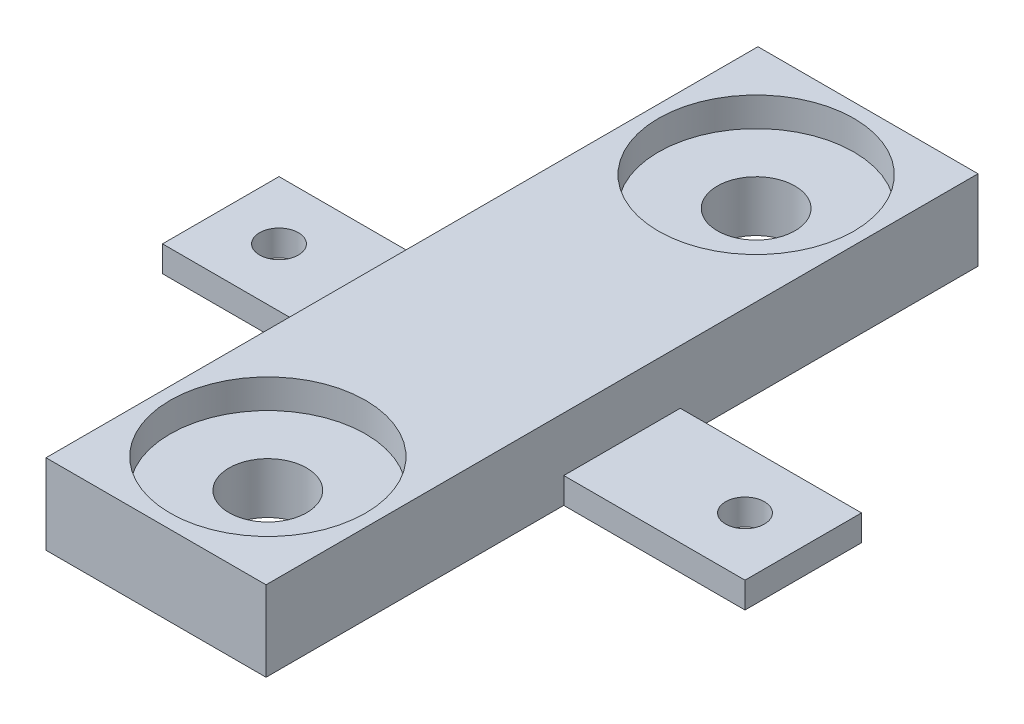
ISO-10303-21;
HEADER;
FILE_DESCRIPTION(('STEP AP214'),'2;1');
FILE_NAME('part.step','',(''),(''),'','','');
FILE_SCHEMA(('AUTOMOTIVE_DESIGN { 1 0 10303 214 1 1 1 1 }'));
ENDSEC;
DATA;
#1=APPLICATION_CONTEXT('core data for automotive mechanical design processes');
#2=APPLICATION_PROTOCOL_DEFINITION('international standard','automotive_design',2000,#1);
#3=PRODUCT_CONTEXT('',#1,'mechanical');
#4=PRODUCT('Part','Part','',(#3));
#5=PRODUCT_RELATED_PRODUCT_CATEGORY('part','',(#4));
#6=PRODUCT_DEFINITION_FORMATION('','',#4);
#7=PRODUCT_DEFINITION_CONTEXT('part definition',#1,'design');
#8=PRODUCT_DEFINITION('design','',#6,#7);
#9=PRODUCT_DEFINITION_SHAPE('','',#8);
#10=(LENGTH_UNIT() NAMED_UNIT(*) SI_UNIT(.MILLI.,.METRE.));
#11=(NAMED_UNIT(*) PLANE_ANGLE_UNIT() SI_UNIT($,.RADIAN.));
#12=(NAMED_UNIT(*) SI_UNIT($,.STERADIAN.) SOLID_ANGLE_UNIT());
#13=UNCERTAINTY_MEASURE_WITH_UNIT(LENGTH_MEASURE(1.E-05),#10,'distance_accuracy_value','');
#14=(GEOMETRIC_REPRESENTATION_CONTEXT(3) GLOBAL_UNCERTAINTY_ASSIGNED_CONTEXT((#13)) GLOBAL_UNIT_ASSIGNED_CONTEXT((#10,
#11,#12)) REPRESENTATION_CONTEXT('',''));
#15=CARTESIAN_POINT('',(0.,0.,0.));
#16=DIRECTION('',(0.,0.,1.));
#17=DIRECTION('',(1.,0.,0.));
#18=AXIS2_PLACEMENT_3D('',#15,#16,#17);
#19=CARTESIAN_POINT('',(0.,2.,0.));
#20=DIRECTION('',(0.,1.,0.));
#21=DIRECTION('',(0.,0.,1.));
#22=AXIS2_PLACEMENT_3D('',#19,#20,#21);
#23=PLANE('',#22);
#24=CARTESIAN_POINT('',(-18.,2.,0.));
#25=DIRECTION('',(0.,1.,0.));
#26=DIRECTION('',(0.,0.,1.));
#27=AXIS2_PLACEMENT_3D('',#24,#25,#26);
#28=CIRCLE('',#27,1.5);
#29=CARTESIAN_POINT('',(-18.,2.,1.5));
#30=VERTEX_POINT('',#29);
#31=EDGE_CURVE('E169',#30,#30,#28,.T.);
#32=ORIENTED_EDGE('',*,*,#31,.F.);
#33=EDGE_LOOP('',(#32));
#34=FACE_BOUND('',#33,.T.);
#35=DIRECTION('',(-1.,0.,0.));
#36=VECTOR('',#35,1.);
#37=CARTESIAN_POINT('',(0.,2.,4.49999999999999));
#38=LINE('',#37,#36);
#39=CARTESIAN_POINT('',(-8.5,2.,4.5));
#40=VERTEX_POINT('',#39);
#41=CARTESIAN_POINT('',(-22.5,2.,4.5));
#42=VERTEX_POINT('',#41);
#43=EDGE_CURVE('E155',#40,#42,#38,.T.);
#44=ORIENTED_EDGE('',*,*,#43,.F.);
#45=DIRECTION('',(0.,0.,-1.));
#46=VECTOR('',#45,1.);
#47=CARTESIAN_POINT('',(-8.5,2.,0.));
#48=LINE('',#47,#46);
#49=CARTESIAN_POINT('',(-8.5,2.,-4.5));
#50=VERTEX_POINT('',#49);
#51=EDGE_CURVE('E255',#40,#50,#48,.T.);
#52=ORIENTED_EDGE('',*,*,#51,.T.);
#53=DIRECTION('',(-1.,0.,0.));
#54=VECTOR('',#53,1.);
#55=CARTESIAN_POINT('',(0.,2.,-4.49999999999999));
#56=LINE('',#55,#54);
#57=CARTESIAN_POINT('',(-22.5,2.,-4.5));
#58=VERTEX_POINT('',#57);
#59=EDGE_CURVE('E138',#50,#58,#56,.T.);
#60=ORIENTED_EDGE('',*,*,#59,.T.);
#61=DIRECTION('',(0.,0.,1.));
#62=VECTOR('',#61,1.);
#63=CARTESIAN_POINT('',(-22.5,2.,0.));
#64=LINE('',#63,#62);
#65=EDGE_CURVE('E269',#58,#42,#64,.T.);
#66=ORIENTED_EDGE('',*,*,#65,.T.);
#67=EDGE_LOOP('',(#44,#52,#60,#66));
#68=FACE_BOUND('',#67,.T.);
#69=ADVANCED_FACE('F64',(#34,#68),#23,.T.);
#70=CARTESIAN_POINT('',(0.,2.,-27.5));
#71=DIRECTION('',(0.,0.,-1.));
#72=DIRECTION('',(-1.,0.,0.));
#73=AXIS2_PLACEMENT_3D('',#70,#71,#72);
#74=PLANE('',#73);
#75=DIRECTION('',(1.,0.,0.));
#76=VECTOR('',#75,1.);
#77=CARTESIAN_POINT('',(0.,0.,-27.5));
#78=LINE('',#77,#76);
#79=CARTESIAN_POINT('',(-8.5,0.,-27.5));
#80=VERTEX_POINT('',#79);
#81=CARTESIAN_POINT('',(8.5,0.,-27.5));
#82=VERTEX_POINT('',#81);
#83=EDGE_CURVE('E180',#80,#82,#78,.T.);
#84=ORIENTED_EDGE('',*,*,#83,.F.);
#85=DIRECTION('',(0.,-1.,0.));
#86=VECTOR('',#85,1.);
#87=CARTESIAN_POINT('',(-8.5,2.,-27.5));
#88=LINE('',#87,#86);
#89=CARTESIAN_POINT('',(-8.5,6.19,-27.5));
#90=VERTEX_POINT('',#89);
#91=EDGE_CURVE('E229',#90,#80,#88,.T.);
#92=ORIENTED_EDGE('',*,*,#91,.F.);
#93=DIRECTION('',(1.,0.,0.));
#94=VECTOR('',#93,1.);
#95=CARTESIAN_POINT('',(0.,6.19,-27.5));
#96=LINE('',#95,#94);
#97=CARTESIAN_POINT('',(8.5,6.19,-27.5));
#98=VERTEX_POINT('',#97);
#99=EDGE_CURVE('E261',#90,#98,#96,.T.);
#100=ORIENTED_EDGE('',*,*,#99,.T.);
#101=DIRECTION('',(0.,-1.,0.));
#102=VECTOR('',#101,1.);
#103=CARTESIAN_POINT('',(8.5,2.,-27.5));
#104=LINE('',#103,#102);
#105=EDGE_CURVE('E231',#98,#82,#104,.T.);
#106=ORIENTED_EDGE('',*,*,#105,.T.);
#107=EDGE_LOOP('',(#84,#92,#100,#106));
#108=FACE_BOUND('',#107,.T.);
#109=ADVANCED_FACE('F66',(#108),#74,.T.);
#110=CARTESIAN_POINT('',(0.,2.,-4.49999999999999));
#111=DIRECTION('',(0.,0.,1.));
#112=DIRECTION('',(1.,0.,0.));
#113=AXIS2_PLACEMENT_3D('',#110,#111,#112);
#114=PLANE('',#113);
#115=DIRECTION('',(-1.,0.,0.));
#116=VECTOR('',#115,1.);
#117=CARTESIAN_POINT('',(0.,0.,-4.49999999999999));
#118=LINE('',#117,#116);
#119=CARTESIAN_POINT('',(-8.5,0.,-4.5));
#120=VERTEX_POINT('',#119);
#121=CARTESIAN_POINT('',(-22.5,0.,-4.5));
#122=VERTEX_POINT('',#121);
#123=EDGE_CURVE('E187',#120,#122,#118,.T.);
#124=ORIENTED_EDGE('',*,*,#123,.T.);
#125=DIRECTION('',(0.,-1.,0.));
#126=VECTOR('',#125,1.);
#127=CARTESIAN_POINT('',(-22.5,2.,-4.5));
#128=LINE('',#127,#126);
#129=EDGE_CURVE('E223',#58,#122,#128,.T.);
#130=ORIENTED_EDGE('',*,*,#129,.F.);
#131=ORIENTED_EDGE('',*,*,#59,.F.);
#132=DIRECTION('',(0.,-1.,0.));
#133=VECTOR('',#132,1.);
#134=CARTESIAN_POINT('',(-8.5,2.,-4.5));
#135=LINE('',#134,#133);
#136=EDGE_CURVE('E226',#50,#120,#135,.T.);
#137=ORIENTED_EDGE('',*,*,#136,.T.);
#138=EDGE_LOOP('',(#124,#130,#131,#137));
#139=FACE_BOUND('',#138,.T.);
#140=ADVANCED_FACE('F336',(#139),#114,.F.);
#141=CARTESIAN_POINT('',(-22.5,2.,0.));
#142=DIRECTION('',(1.,0.,0.));
#143=DIRECTION('',(0.,0.,-1.));
#144=AXIS2_PLACEMENT_3D('',#141,#142,#143);
#145=PLANE('',#144);
#146=DIRECTION('',(0.,0.,1.));
#147=VECTOR('',#146,1.);
#148=CARTESIAN_POINT('',(-22.5,0.,0.));
#149=LINE('',#148,#147);
#150=CARTESIAN_POINT('',(-22.5,0.,4.5));
#151=VERTEX_POINT('',#150);
#152=EDGE_CURVE('E190',#122,#151,#149,.T.);
#153=ORIENTED_EDGE('',*,*,#152,.T.);
#154=DIRECTION('',(0.,-1.,0.));
#155=VECTOR('',#154,1.);
#156=CARTESIAN_POINT('',(-22.5,2.,4.5));
#157=LINE('',#156,#155);
#158=EDGE_CURVE('E221',#42,#151,#157,.T.);
#159=ORIENTED_EDGE('',*,*,#158,.F.);
#160=ORIENTED_EDGE('',*,*,#65,.F.);
#161=ORIENTED_EDGE('',*,*,#129,.T.);
#162=EDGE_LOOP('',(#153,#159,#160,#161));
#163=FACE_BOUND('',#162,.T.);
#164=ADVANCED_FACE('F490',(#163),#145,.F.);
#165=CARTESIAN_POINT('',(0.,2.,4.49999999999999));
#166=DIRECTION('',(0.,0.,1.));
#167=DIRECTION('',(1.,0.,0.));
#168=AXIS2_PLACEMENT_3D('',#165,#166,#167);
#169=PLANE('',#168);
#170=DIRECTION('',(-1.,0.,0.));
#171=VECTOR('',#170,1.);
#172=CARTESIAN_POINT('',(0.,0.,4.49999999999999));
#173=LINE('',#172,#171);
#174=CARTESIAN_POINT('',(-8.5,0.,4.49999999999999));
#175=VERTEX_POINT('',#174);
#176=EDGE_CURVE('E193',#175,#151,#173,.T.);
#177=ORIENTED_EDGE('',*,*,#176,.F.);
#178=DIRECTION('',(0.,-1.,0.));
#179=VECTOR('',#178,1.);
#180=CARTESIAN_POINT('',(-8.5,2.,4.49999999999999));
#181=LINE('',#180,#179);
#182=EDGE_CURVE('E219',#40,#175,#181,.T.);
#183=ORIENTED_EDGE('',*,*,#182,.F.);
#184=ORIENTED_EDGE('',*,*,#43,.T.);
#185=ORIENTED_EDGE('',*,*,#158,.T.);
#186=EDGE_LOOP('',(#177,#183,#184,#185));
#187=FACE_BOUND('',#186,.T.);
#188=ADVANCED_FACE('F275',(#187),#169,.T.);
#189=CARTESIAN_POINT('',(-8.5,2.,0.));
#190=DIRECTION('',(1.,0.,0.));
#191=DIRECTION('',(0.,0.,-1.));
#192=AXIS2_PLACEMENT_3D('',#189,#190,#191);
#193=PLANE('',#192);
#194=DIRECTION('',(0.,0.,1.));
#195=VECTOR('',#194,1.);
#196=CARTESIAN_POINT('',(-8.5,0.,0.));
#197=LINE('',#196,#195);
#198=CARTESIAN_POINT('',(-8.49999999999999,0.,27.5));
#199=VERTEX_POINT('',#198);
#200=EDGE_CURVE('E188',#175,#199,#197,.T.);
#201=ORIENTED_EDGE('',*,*,#200,.T.);
#202=DIRECTION('',(0.,-1.,0.));
#203=VECTOR('',#202,1.);
#204=CARTESIAN_POINT('',(-8.49999999999999,2.,27.5));
#205=LINE('',#204,#203);
#206=CARTESIAN_POINT('',(-8.49999999999999,6.19,27.5));
#207=VERTEX_POINT('',#206);
#208=EDGE_CURVE('E216',#207,#199,#205,.T.);
#209=ORIENTED_EDGE('',*,*,#208,.F.);
#210=DIRECTION('',(0.,0.,1.));
#211=VECTOR('',#210,1.);
#212=CARTESIAN_POINT('',(-8.5,6.19,0.));
#213=LINE('',#212,#211);
#214=EDGE_CURVE('E181',#90,#207,#213,.T.);
#215=ORIENTED_EDGE('',*,*,#214,.F.);
#216=ORIENTED_EDGE('',*,*,#91,.T.);
#217=EDGE_CURVE('E185',#80,#120,#197,.T.);
#218=ORIENTED_EDGE('',*,*,#217,.T.);
#219=ORIENTED_EDGE('',*,*,#136,.F.);
#220=ORIENTED_EDGE('',*,*,#51,.F.);
#221=ORIENTED_EDGE('',*,*,#182,.T.);
#222=EDGE_LOOP('',(#201,#209,#215,#216,#218,#219,#220,#221));
#223=FACE_BOUND('',#222,.T.);
#224=ADVANCED_FACE('F311',(#223),#193,.F.);
#225=CARTESIAN_POINT('',(0.,2.,27.5));
#226=DIRECTION('',(0.,0.,-1.));
#227=DIRECTION('',(-1.,0.,0.));
#228=AXIS2_PLACEMENT_3D('',#225,#226,#227);
#229=PLANE('',#228);
#230=DIRECTION('',(1.,0.,0.));
#231=VECTOR('',#230,1.);
#232=CARTESIAN_POINT('',(0.,0.,27.5));
#233=LINE('',#232,#231);
#234=CARTESIAN_POINT('',(8.5,0.,27.5));
#235=VERTEX_POINT('',#234);
#236=EDGE_CURVE('E196',#199,#235,#233,.T.);
#237=ORIENTED_EDGE('',*,*,#236,.T.);
#238=DIRECTION('',(0.,-1.,0.));
#239=VECTOR('',#238,1.);
#240=CARTESIAN_POINT('',(8.5,2.,27.5));
#241=LINE('',#240,#239);
#242=CARTESIAN_POINT('',(8.5,6.19,27.5));
#243=VERTEX_POINT('',#242);
#244=EDGE_CURVE('E214',#243,#235,#241,.T.);
#245=ORIENTED_EDGE('',*,*,#244,.F.);
#246=DIRECTION('',(1.,0.,0.));
#247=VECTOR('',#246,1.);
#248=CARTESIAN_POINT('',(0.,6.19,27.5));
#249=LINE('',#248,#247);
#250=EDGE_CURVE('E252',#207,#243,#249,.T.);
#251=ORIENTED_EDGE('',*,*,#250,.F.);
#252=ORIENTED_EDGE('',*,*,#208,.T.);
#253=EDGE_LOOP('',(#237,#245,#251,#252));
#254=FACE_BOUND('',#253,.T.);
#255=ADVANCED_FACE('F298',(#254),#229,.F.);
#256=CARTESIAN_POINT('',(8.5,2.,0.));
#257=DIRECTION('',(1.,0.,0.));
#258=DIRECTION('',(0.,0.,-1.));
#259=AXIS2_PLACEMENT_3D('',#256,#257,#258);
#260=PLANE('',#259);
#261=DIRECTION('',(0.,0.,1.));
#262=VECTOR('',#261,1.);
#263=CARTESIAN_POINT('',(8.5,0.,0.));
#264=LINE('',#263,#262);
#265=CARTESIAN_POINT('',(8.5,0.,4.5));
#266=VERTEX_POINT('',#265);
#267=EDGE_CURVE('E182',#266,#235,#264,.T.);
#268=ORIENTED_EDGE('',*,*,#267,.F.);
#269=DIRECTION('',(0.,-1.,0.));
#270=VECTOR('',#269,1.);
#271=CARTESIAN_POINT('',(8.5,2.,4.5));
#272=LINE('',#271,#270);
#273=CARTESIAN_POINT('',(8.5,2.,4.49999999999999));
#274=VERTEX_POINT('',#273);
#275=EDGE_CURVE('E164',#274,#266,#272,.T.);
#276=ORIENTED_EDGE('',*,*,#275,.F.);
#277=DIRECTION('',(0.,0.,-1.));
#278=VECTOR('',#277,1.);
#279=CARTESIAN_POINT('',(8.5,2.,0.));
#280=LINE('',#279,#278);
#281=CARTESIAN_POINT('',(8.5,2.,-4.5));
#282=VERTEX_POINT('',#281);
#283=EDGE_CURVE('E83',#274,#282,#280,.T.);
#284=ORIENTED_EDGE('',*,*,#283,.T.);
#285=DIRECTION('',(0.,-1.,0.));
#286=VECTOR('',#285,1.);
#287=CARTESIAN_POINT('',(8.5,2.,-4.5));
#288=LINE('',#287,#286);
#289=CARTESIAN_POINT('',(8.5,0.,-4.5));
#290=VERTEX_POINT('',#289);
#291=EDGE_CURVE('E129',#282,#290,#288,.T.);
#292=ORIENTED_EDGE('',*,*,#291,.T.);
#293=EDGE_CURVE('E178',#82,#290,#264,.T.);
#294=ORIENTED_EDGE('',*,*,#293,.F.);
#295=ORIENTED_EDGE('',*,*,#105,.F.);
#296=DIRECTION('',(0.,0.,1.));
#297=VECTOR('',#296,1.);
#298=CARTESIAN_POINT('',(8.5,6.19,0.));
#299=LINE('',#298,#297);
#300=EDGE_CURVE('E258',#98,#243,#299,.T.);
#301=ORIENTED_EDGE('',*,*,#300,.T.);
#302=ORIENTED_EDGE('',*,*,#244,.T.);
#303=EDGE_LOOP('',(#268,#276,#284,#292,#294,#295,#301,#302));
#304=FACE_BOUND('',#303,.T.);
#305=ADVANCED_FACE('F307',(#304),#260,.T.);
#306=CARTESIAN_POINT('',(0.,2.,4.5));
#307=DIRECTION('',(0.,0.,-1.));
#308=DIRECTION('',(-1.,0.,0.));
#309=AXIS2_PLACEMENT_3D('',#306,#307,#308);
#310=PLANE('',#309);
#311=DIRECTION('',(1.,0.,0.));
#312=VECTOR('',#311,1.);
#313=CARTESIAN_POINT('',(0.,0.,4.5));
#314=LINE('',#313,#312);
#315=CARTESIAN_POINT('',(22.5,0.,4.49999999999999));
#316=VERTEX_POINT('',#315);
#317=EDGE_CURVE('E161',#266,#316,#314,.T.);
#318=ORIENTED_EDGE('',*,*,#317,.T.);
#319=DIRECTION('',(0.,-1.,0.));
#320=VECTOR('',#319,1.);
#321=CARTESIAN_POINT('',(22.5,2.,4.49999999999999));
#322=LINE('',#321,#320);
#323=CARTESIAN_POINT('',(22.5,2.,4.49999999999999));
#324=VERTEX_POINT('',#323);
#325=EDGE_CURVE('E158',#324,#316,#322,.T.);
#326=ORIENTED_EDGE('',*,*,#325,.F.);
#327=DIRECTION('',(1.,0.,0.));
#328=VECTOR('',#327,1.);
#329=CARTESIAN_POINT('',(0.,2.,4.5));
#330=LINE('',#329,#328);
#331=EDGE_CURVE('E147',#274,#324,#330,.T.);
#332=ORIENTED_EDGE('',*,*,#331,.F.);
#333=ORIENTED_EDGE('',*,*,#275,.T.);
#334=EDGE_LOOP('',(#318,#326,#332,#333));
#335=FACE_BOUND('',#334,.T.);
#336=ADVANCED_FACE('F159',(#335),#310,.F.);
#337=CARTESIAN_POINT('',(22.5,2.,0.));
#338=DIRECTION('',(1.,0.,0.));
#339=DIRECTION('',(0.,0.,-1.));
#340=AXIS2_PLACEMENT_3D('',#337,#338,#339);
#341=PLANE('',#340);
#342=DIRECTION('',(0.,0.,1.));
#343=VECTOR('',#342,1.);
#344=CARTESIAN_POINT('',(22.5,0.,0.));
#345=LINE('',#344,#343);
#346=CARTESIAN_POINT('',(22.5,0.,-4.50000000000001));
#347=VERTEX_POINT('',#346);
#348=EDGE_CURVE('E200',#347,#316,#345,.T.);
#349=ORIENTED_EDGE('',*,*,#348,.F.);
#350=DIRECTION('',(0.,-1.,0.));
#351=VECTOR('',#350,1.);
#352=CARTESIAN_POINT('',(22.5,2.,-4.50000000000001));
#353=LINE('',#352,#351);
#354=CARTESIAN_POINT('',(22.5,2.,-4.50000000000001));
#355=VERTEX_POINT('',#354);
#356=EDGE_CURVE('E125',#355,#347,#353,.T.);
#357=ORIENTED_EDGE('',*,*,#356,.F.);
#358=DIRECTION('',(0.,0.,1.));
#359=VECTOR('',#358,1.);
#360=CARTESIAN_POINT('',(22.5,2.,0.));
#361=LINE('',#360,#359);
#362=EDGE_CURVE('E153',#355,#324,#361,.T.);
#363=ORIENTED_EDGE('',*,*,#362,.T.);
#364=ORIENTED_EDGE('',*,*,#325,.T.);
#365=EDGE_LOOP('',(#349,#357,#363,#364));
#366=FACE_BOUND('',#365,.T.);
#367=ADVANCED_FACE('F166',(#366),#341,.T.);
#368=CARTESIAN_POINT('',(-18.,2.,0.));
#369=DIRECTION('',(0.,-1.,0.));
#370=DIRECTION('',(0.,0.,-1.));
#371=AXIS2_PLACEMENT_3D('',#368,#369,#370);
#372=CYLINDRICAL_SURFACE('',#371,1.5);
#373=ORIENTED_EDGE('',*,*,#31,.T.);
#374=EDGE_LOOP('',(#373));
#375=FACE_BOUND('',#374,.T.);
#376=CARTESIAN_POINT('',(-18.,0.,0.));
#377=DIRECTION('',(0.,1.,0.));
#378=DIRECTION('',(0.,0.,1.));
#379=AXIS2_PLACEMENT_3D('',#376,#377,#378);
#380=CIRCLE('',#379,1.5);
#381=CARTESIAN_POINT('',(-18.,0.,1.5));
#382=VERTEX_POINT('',#381);
#383=EDGE_CURVE('E205',#382,#382,#380,.T.);
#384=ORIENTED_EDGE('',*,*,#383,.F.);
#385=EDGE_LOOP('',(#384));
#386=FACE_BOUND('',#385,.T.);
#387=ADVANCED_FACE('F319',(#375,#386),#372,.F.);
#388=CARTESIAN_POINT('',(0.,2.,-4.49999999999999));
#389=DIRECTION('',(0.,0.,-1.));
#390=DIRECTION('',(-1.,0.,0.));
#391=AXIS2_PLACEMENT_3D('',#388,#389,#390);
#392=PLANE('',#391);
#393=DIRECTION('',(1.,0.,0.));
#394=VECTOR('',#393,1.);
#395=CARTESIAN_POINT('',(0.,0.,-4.49999999999999));
#396=LINE('',#395,#394);
#397=EDGE_CURVE('E202',#290,#347,#396,.T.);
#398=ORIENTED_EDGE('',*,*,#397,.F.);
#399=ORIENTED_EDGE('',*,*,#291,.F.);
#400=DIRECTION('',(1.,0.,0.));
#401=VECTOR('',#400,1.);
#402=CARTESIAN_POINT('',(0.,2.,-4.49999999999999));
#403=LINE('',#402,#401);
#404=EDGE_CURVE('E167',#282,#355,#403,.T.);
#405=ORIENTED_EDGE('',*,*,#404,.T.);
#406=ORIENTED_EDGE('',*,*,#356,.T.);
#407=EDGE_LOOP('',(#398,#399,#405,#406));
#408=FACE_BOUND('',#407,.T.);
#409=ADVANCED_FACE('F316',(#408),#392,.T.);
#410=CARTESIAN_POINT('',(18.,2.,0.));
#411=DIRECTION('',(0.,-1.,0.));
#412=DIRECTION('',(0.,0.,-1.));
#413=AXIS2_PLACEMENT_3D('',#410,#411,#412);
#414=CYLINDRICAL_SURFACE('',#413,1.5);
#415=CARTESIAN_POINT('',(18.,2.,0.));
#416=DIRECTION('',(0.,1.,0.));
#417=DIRECTION('',(0.,0.,1.));
#418=AXIS2_PLACEMENT_3D('',#415,#416,#417);
#419=CIRCLE('',#418,1.5);
#420=CARTESIAN_POINT('',(18.,2.,1.49999999999999));
#421=VERTEX_POINT('',#420);
#422=EDGE_CURVE('E175',#421,#421,#419,.T.);
#423=ORIENTED_EDGE('',*,*,#422,.T.);
#424=EDGE_LOOP('',(#423));
#425=FACE_BOUND('',#424,.T.);
#426=CARTESIAN_POINT('',(18.,0.,0.));
#427=DIRECTION('',(0.,1.,0.));
#428=DIRECTION('',(0.,0.,1.));
#429=AXIS2_PLACEMENT_3D('',#426,#427,#428);
#430=CIRCLE('',#429,1.5);
#431=CARTESIAN_POINT('',(18.,0.,1.49999999999999));
#432=VERTEX_POINT('',#431);
#433=EDGE_CURVE('E208',#432,#432,#430,.T.);
#434=ORIENTED_EDGE('',*,*,#433,.F.);
#435=EDGE_LOOP('',(#434));
#436=FACE_BOUND('',#435,.T.);
#437=ADVANCED_FACE('F318',(#425,#436),#414,.F.);
#438=ORIENTED_EDGE('',*,*,#283,.F.);
#439=ORIENTED_EDGE('',*,*,#331,.T.);
#440=ORIENTED_EDGE('',*,*,#362,.F.);
#441=ORIENTED_EDGE('',*,*,#404,.F.);
#442=EDGE_LOOP('',(#438,#439,#440,#441));
#443=FACE_BOUND('',#442,.T.);
#444=ORIENTED_EDGE('',*,*,#422,.F.);
#445=EDGE_LOOP('',(#444));
#446=FACE_BOUND('',#445,.T.);
#447=ADVANCED_FACE('F149',(#443,#446),#23,.T.);
#448=CARTESIAN_POINT('',(0.,0.,0.));
#449=DIRECTION('',(0.,1.,0.));
#450=DIRECTION('',(0.,0.,1.));
#451=AXIS2_PLACEMENT_3D('',#448,#449,#450);
#452=PLANE('',#451);
#453=CARTESIAN_POINT('',(0.,0.,-18.8625));
#454=DIRECTION('',(0.,-1.,0.));
#455=DIRECTION('',(0.,0.,-1.));
#456=AXIS2_PLACEMENT_3D('',#453,#454,#455);
#457=CIRCLE('',#456,3.);
#458=CARTESIAN_POINT('',(0.,0.,-21.8625));
#459=VERTEX_POINT('',#458);
#460=EDGE_CURVE('E234',#459,#459,#457,.T.);
#461=ORIENTED_EDGE('',*,*,#460,.F.);
#462=EDGE_LOOP('',(#461));
#463=FACE_BOUND('',#462,.T.);
#464=CARTESIAN_POINT('',(0.,0.,18.8625));
#465=DIRECTION('',(0.,-1.,0.));
#466=DIRECTION('',(0.,0.,-1.));
#467=AXIS2_PLACEMENT_3D('',#464,#465,#466);
#468=CIRCLE('',#467,3.);
#469=CARTESIAN_POINT('',(0.,0.,15.8625));
#470=VERTEX_POINT('',#469);
#471=EDGE_CURVE('E240',#470,#470,#468,.T.);
#472=ORIENTED_EDGE('',*,*,#471,.F.);
#473=EDGE_LOOP('',(#472));
#474=FACE_BOUND('',#473,.T.);
#475=ORIENTED_EDGE('',*,*,#293,.T.);
#476=ORIENTED_EDGE('',*,*,#397,.T.);
#477=ORIENTED_EDGE('',*,*,#348,.T.);
#478=ORIENTED_EDGE('',*,*,#317,.F.);
#479=ORIENTED_EDGE('',*,*,#267,.T.);
#480=ORIENTED_EDGE('',*,*,#236,.F.);
#481=ORIENTED_EDGE('',*,*,#200,.F.);
#482=ORIENTED_EDGE('',*,*,#176,.T.);
#483=ORIENTED_EDGE('',*,*,#152,.F.);
#484=ORIENTED_EDGE('',*,*,#123,.F.);
#485=ORIENTED_EDGE('',*,*,#217,.F.);
#486=ORIENTED_EDGE('',*,*,#83,.T.);
#487=EDGE_LOOP('',(#475,#476,#477,#478,#479,#480,#481,#482,#483,#484,#485,#486));
#488=FACE_BOUND('',#487,.T.);
#489=ORIENTED_EDGE('',*,*,#383,.T.);
#490=EDGE_LOOP('',(#489));
#491=FACE_BOUND('',#490,.T.);
#492=ORIENTED_EDGE('',*,*,#433,.T.);
#493=EDGE_LOOP('',(#492));
#494=FACE_BOUND('',#493,.T.);
#495=ADVANCED_FACE('F314',(#463,#474,#488,#491,#494),#452,.F.);
#496=CARTESIAN_POINT('',(0.,6.19,0.));
#497=DIRECTION('',(0.,-1.,0.));
#498=DIRECTION('',(0.,0.,-1.));
#499=AXIS2_PLACEMENT_3D('',#496,#497,#498);
#500=PLANE('',#499);
#501=CARTESIAN_POINT('',(0.,6.19,18.8625));
#502=DIRECTION('',(0.,-1.,0.));
#503=DIRECTION('',(0.,0.,-1.));
#504=AXIS2_PLACEMENT_3D('',#501,#502,#503);
#505=CIRCLE('',#504,7.55);
#506=CARTESIAN_POINT('',(0.,6.19,11.3125));
#507=VERTEX_POINT('',#506);
#508=EDGE_CURVE('E238',#507,#507,#505,.T.);
#509=ORIENTED_EDGE('',*,*,#508,.T.);
#510=EDGE_LOOP('',(#509));
#511=FACE_BOUND('',#510,.T.);
#512=CARTESIAN_POINT('',(0.,6.19,-18.8625));
#513=DIRECTION('',(0.,-1.,0.));
#514=DIRECTION('',(0.,0.,-1.));
#515=AXIS2_PLACEMENT_3D('',#512,#513,#514);
#516=CIRCLE('',#515,7.55);
#517=CARTESIAN_POINT('',(0.,6.19,-26.4125));
#518=VERTEX_POINT('',#517);
#519=EDGE_CURVE('E248',#518,#518,#516,.T.);
#520=ORIENTED_EDGE('',*,*,#519,.T.);
#521=EDGE_LOOP('',(#520));
#522=FACE_BOUND('',#521,.T.);
#523=ORIENTED_EDGE('',*,*,#250,.T.);
#524=ORIENTED_EDGE('',*,*,#300,.F.);
#525=ORIENTED_EDGE('',*,*,#99,.F.);
#526=ORIENTED_EDGE('',*,*,#214,.T.);
#527=EDGE_LOOP('',(#523,#524,#525,#526));
#528=FACE_BOUND('',#527,.T.);
#529=ADVANCED_FACE('F304',(#511,#522,#528),#500,.F.);
#530=CARTESIAN_POINT('',(0.,6.19,-18.8625));
#531=DIRECTION('',(0.,-1.,0.));
#532=DIRECTION('',(0.,0.,-1.));
#533=AXIS2_PLACEMENT_3D('',#530,#531,#532);
#534=CYLINDRICAL_SURFACE('',#533,7.55);
#535=ORIENTED_EDGE('',*,*,#519,.F.);
#536=EDGE_LOOP('',(#535));
#537=FACE_BOUND('',#536,.T.);
#538=CARTESIAN_POINT('',(0.,3.94,-18.8625));
#539=DIRECTION('',(0.,-1.,0.));
#540=DIRECTION('',(0.,0.,-1.));
#541=AXIS2_PLACEMENT_3D('',#538,#539,#540);
#542=CIRCLE('',#541,7.55);
#543=CARTESIAN_POINT('',(0.,3.94,-26.4125));
#544=VERTEX_POINT('',#543);
#545=EDGE_CURVE('E74',#544,#544,#542,.T.);
#546=ORIENTED_EDGE('',*,*,#545,.T.);
#547=EDGE_LOOP('',(#546));
#548=FACE_BOUND('',#547,.T.);
#549=ADVANCED_FACE('F348',(#537,#548),#534,.F.);
#550=CARTESIAN_POINT('',(0.,6.19,18.8625));
#551=DIRECTION('',(0.,-1.,0.));
#552=DIRECTION('',(0.,0.,-1.));
#553=AXIS2_PLACEMENT_3D('',#550,#551,#552);
#554=CYLINDRICAL_SURFACE('',#553,7.55);
#555=ORIENTED_EDGE('',*,*,#508,.F.);
#556=EDGE_LOOP('',(#555));
#557=FACE_BOUND('',#556,.T.);
#558=CARTESIAN_POINT('',(0.,3.94,18.8625));
#559=DIRECTION('',(0.,-1.,0.));
#560=DIRECTION('',(0.,0.,-1.));
#561=AXIS2_PLACEMENT_3D('',#558,#559,#560);
#562=CIRCLE('',#561,7.55);
#563=CARTESIAN_POINT('',(0.,3.94,11.3125));
#564=VERTEX_POINT('',#563);
#565=EDGE_CURVE('E12',#564,#564,#562,.T.);
#566=ORIENTED_EDGE('',*,*,#565,.T.);
#567=EDGE_LOOP('',(#566));
#568=FACE_BOUND('',#567,.T.);
#569=ADVANCED_FACE('F367',(#557,#568),#554,.F.);
#570=CARTESIAN_POINT('',(0.,3.94,0.));
#571=DIRECTION('',(0.,-1.,0.));
#572=DIRECTION('',(0.,0.,-1.));
#573=AXIS2_PLACEMENT_3D('',#570,#571,#572);
#574=PLANE('',#573);
#575=CARTESIAN_POINT('',(0.,3.94,-18.8625));
#576=DIRECTION('',(0.,-1.,0.));
#577=DIRECTION('',(0.,0.,-1.));
#578=AXIS2_PLACEMENT_3D('',#575,#576,#577);
#579=CIRCLE('',#578,3.);
#580=CARTESIAN_POINT('',(0.,3.94,-21.8625));
#581=VERTEX_POINT('',#580);
#582=EDGE_CURVE('E68',#581,#581,#579,.T.);
#583=ORIENTED_EDGE('',*,*,#582,.T.);
#584=EDGE_LOOP('',(#583));
#585=FACE_BOUND('',#584,.T.);
#586=ORIENTED_EDGE('',*,*,#545,.F.);
#587=EDGE_LOOP('',(#586));
#588=FACE_BOUND('',#587,.T.);
#589=ADVANCED_FACE('F365',(#585,#588),#574,.F.);
#590=CARTESIAN_POINT('',(0.,3.94,18.8625));
#591=DIRECTION('',(0.,-1.,0.));
#592=DIRECTION('',(0.,0.,-1.));
#593=AXIS2_PLACEMENT_3D('',#590,#591,#592);
#594=CIRCLE('',#593,3.);
#595=CARTESIAN_POINT('',(0.,3.94,15.8625));
#596=VERTEX_POINT('',#595);
#597=EDGE_CURVE('E232',#596,#596,#594,.T.);
#598=ORIENTED_EDGE('',*,*,#597,.T.);
#599=EDGE_LOOP('',(#598));
#600=FACE_BOUND('',#599,.T.);
#601=ORIENTED_EDGE('',*,*,#565,.F.);
#602=EDGE_LOOP('',(#601));
#603=FACE_BOUND('',#602,.T.);
#604=ADVANCED_FACE('F358',(#600,#603),#574,.F.);
#605=CARTESIAN_POINT('',(0.,6.19,18.8625));
#606=DIRECTION('',(0.,-1.,0.));
#607=DIRECTION('',(0.,0.,-1.));
#608=AXIS2_PLACEMENT_3D('',#605,#606,#607);
#609=CYLINDRICAL_SURFACE('',#608,3.);
#610=ORIENTED_EDGE('',*,*,#471,.T.);
#611=EDGE_LOOP('',(#610));
#612=FACE_BOUND('',#611,.T.);
#613=ORIENTED_EDGE('',*,*,#597,.F.);
#614=EDGE_LOOP('',(#613));
#615=FACE_BOUND('',#614,.T.);
#616=ADVANCED_FACE('F354',(#612,#615),#609,.F.);
#617=CARTESIAN_POINT('',(0.,6.19,-18.8625));
#618=DIRECTION('',(0.,-1.,0.));
#619=DIRECTION('',(0.,0.,-1.));
#620=AXIS2_PLACEMENT_3D('',#617,#618,#619);
#621=CYLINDRICAL_SURFACE('',#620,3.);
#622=ORIENTED_EDGE('',*,*,#460,.T.);
#623=EDGE_LOOP('',(#622));
#624=FACE_BOUND('',#623,.T.);
#625=ORIENTED_EDGE('',*,*,#582,.F.);
#626=EDGE_LOOP('',(#625));
#627=FACE_BOUND('',#626,.T.);
#628=ADVANCED_FACE('F357',(#624,#627),#621,.F.);
#629=CLOSED_SHELL('',(#69,#109,#140,#164,#188,#224,#255,#305,#336,#367,#387,#409,#437,#447,#495,
#529,#549,#569,#589,#604,#616,#628));
#630=MANIFOLD_SOLID_BREP('B2',#629);
#631=ADVANCED_BREP_SHAPE_REPRESENTATION('',(#18,#630),#14);
#632=SHAPE_DEFINITION_REPRESENTATION(#9,#631);
ENDSEC;
END-ISO-10303-21;
